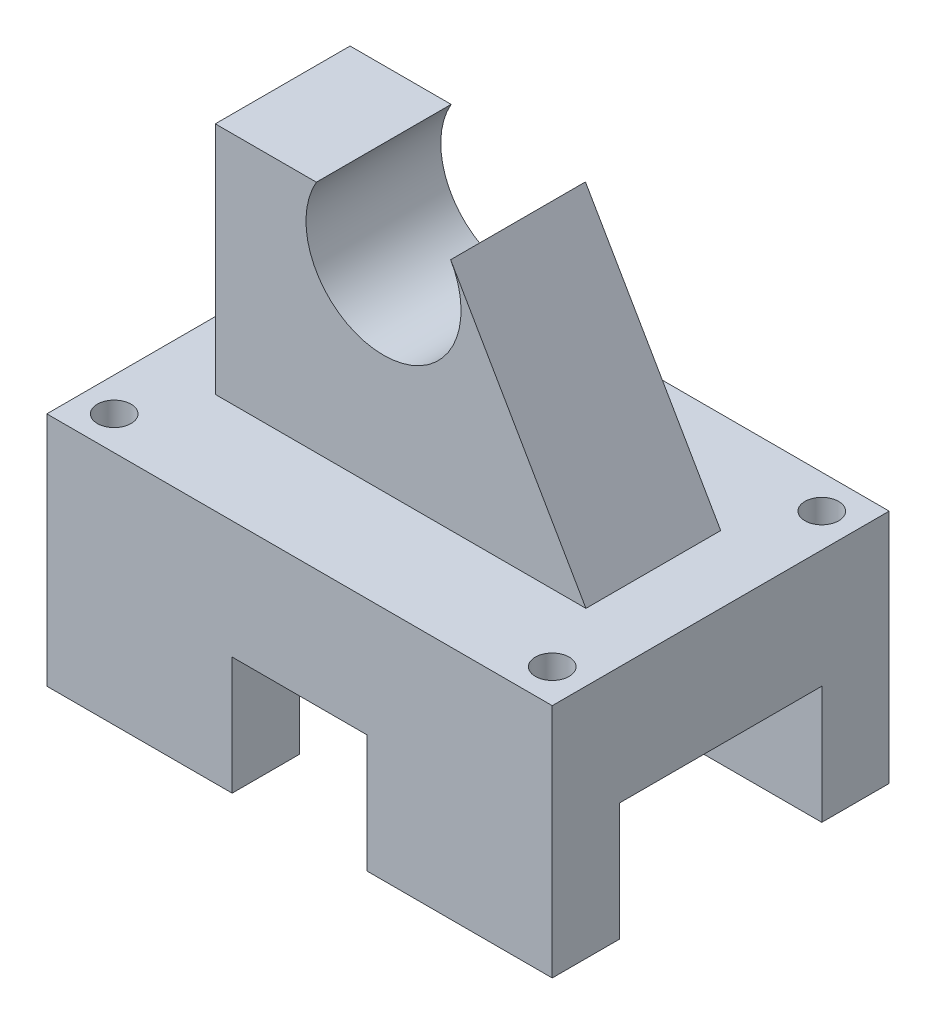
ISO-10303-21;
HEADER;
FILE_DESCRIPTION(('STEP AP214'),'2;1');
FILE_NAME('part.step','',(''),(''),'','','');
FILE_SCHEMA(('AUTOMOTIVE_DESIGN { 1 0 10303 214 1 1 1 1 }'));
ENDSEC;
DATA;
#1=APPLICATION_CONTEXT('core data for automotive mechanical design processes');
#2=APPLICATION_PROTOCOL_DEFINITION('international standard','automotive_design',2000,#1);
#3=PRODUCT_CONTEXT('',#1,'mechanical');
#4=PRODUCT('Part','Part','',(#3));
#5=PRODUCT_RELATED_PRODUCT_CATEGORY('part','',(#4));
#6=PRODUCT_DEFINITION_FORMATION('','',#4);
#7=PRODUCT_DEFINITION_CONTEXT('part definition',#1,'design');
#8=PRODUCT_DEFINITION('design','',#6,#7);
#9=PRODUCT_DEFINITION_SHAPE('','',#8);
#10=(LENGTH_UNIT() NAMED_UNIT(*) SI_UNIT(.MILLI.,.METRE.));
#11=(NAMED_UNIT(*) PLANE_ANGLE_UNIT() SI_UNIT($,.RADIAN.));
#12=(NAMED_UNIT(*) SI_UNIT($,.STERADIAN.) SOLID_ANGLE_UNIT());
#13=UNCERTAINTY_MEASURE_WITH_UNIT(LENGTH_MEASURE(1.E-05),#10,'distance_accuracy_value','');
#14=(GEOMETRIC_REPRESENTATION_CONTEXT(3) GLOBAL_UNCERTAINTY_ASSIGNED_CONTEXT((#13)) GLOBAL_UNIT_ASSIGNED_CONTEXT((#10,
#11,#12)) REPRESENTATION_CONTEXT('',''));
#15=CARTESIAN_POINT('',(0.,0.,0.));
#16=DIRECTION('',(0.,0.,1.));
#17=DIRECTION('',(1.,0.,0.));
#18=AXIS2_PLACEMENT_3D('',#15,#16,#17);
#19=CARTESIAN_POINT('',(-75.,-35.,100.));
#20=DIRECTION('',(0.,1.,0.));
#21=DIRECTION('',(0.,0.,1.));
#22=AXIS2_PLACEMENT_3D('',#19,#20,#21);
#23=PLANE('',#22);
#24=DIRECTION('',(0.,0.,-1.));
#25=VECTOR('',#24,1.);
#26=CARTESIAN_POINT('',(-75.,-35.,100.));
#27=LINE('',#26,#25);
#28=CARTESIAN_POINT('',(-75.,-35.,100.));
#29=VERTEX_POINT('',#28);
#30=CARTESIAN_POINT('',(-75.,-35.,80.));
#31=VERTEX_POINT('',#30);
#32=EDGE_CURVE('E356',#29,#31,#27,.T.);
#33=ORIENTED_EDGE('',*,*,#32,.T.);
#34=DIRECTION('',(1.,0.,0.));
#35=VECTOR('',#34,1.);
#36=CARTESIAN_POINT('',(-75.,-35.,80.));
#37=LINE('',#36,#35);
#38=CARTESIAN_POINT('',(-20.,-35.,80.));
#39=VERTEX_POINT('',#38);
#40=EDGE_CURVE('E265',#31,#39,#37,.T.);
#41=ORIENTED_EDGE('',*,*,#40,.T.);
#42=DIRECTION('',(0.,0.,1.));
#43=VECTOR('',#42,1.);
#44=CARTESIAN_POINT('',(-20.,-35.,0.));
#45=LINE('',#44,#43);
#46=CARTESIAN_POINT('',(-20.,-35.,100.));
#47=VERTEX_POINT('',#46);
#48=EDGE_CURVE('E305',#39,#47,#45,.T.);
#49=ORIENTED_EDGE('',*,*,#48,.T.);
#50=DIRECTION('',(1.,0.,0.));
#51=VECTOR('',#50,1.);
#52=CARTESIAN_POINT('',(-75.,-35.,100.));
#53=LINE('',#52,#51);
#54=EDGE_CURVE('E332',#29,#47,#53,.T.);
#55=ORIENTED_EDGE('',*,*,#54,.F.);
#56=EDGE_LOOP('',(#33,#41,#49,#55));
#57=FACE_BOUND('',#56,.T.);
#58=ADVANCED_FACE('F43',(#57),#23,.F.);
#59=DIRECTION('',(0.,0.,1.));
#60=VECTOR('',#59,1.);
#61=CARTESIAN_POINT('',(20.,-35.,0.));
#62=LINE('',#61,#60);
#63=CARTESIAN_POINT('',(20.,-35.,80.));
#64=VERTEX_POINT('',#63);
#65=CARTESIAN_POINT('',(20.,-35.,100.));
#66=VERTEX_POINT('',#65);
#67=EDGE_CURVE('E289',#64,#66,#62,.T.);
#68=ORIENTED_EDGE('',*,*,#67,.F.);
#69=CARTESIAN_POINT('',(75.,-35.,80.));
#70=VERTEX_POINT('',#69);
#71=EDGE_CURVE('E240',#64,#70,#37,.T.);
#72=ORIENTED_EDGE('',*,*,#71,.T.);
#73=DIRECTION('',(0.,0.,-1.));
#74=VECTOR('',#73,1.);
#75=CARTESIAN_POINT('',(75.,-35.,100.));
#76=LINE('',#75,#74);
#77=CARTESIAN_POINT('',(75.,-35.,100.));
#78=VERTEX_POINT('',#77);
#79=EDGE_CURVE('E351',#78,#70,#76,.T.);
#80=ORIENTED_EDGE('',*,*,#79,.F.);
#81=EDGE_CURVE('E331',#66,#78,#53,.T.);
#82=ORIENTED_EDGE('',*,*,#81,.F.);
#83=EDGE_LOOP('',(#68,#72,#80,#82));
#84=FACE_BOUND('',#83,.T.);
#85=ADVANCED_FACE('F473',(#84),#23,.F.);
#86=CARTESIAN_POINT('',(-20.,-35.,0.));
#87=DIRECTION('',(-1.,0.,0.));
#88=DIRECTION('',(0.,-1.,0.));
#89=AXIS2_PLACEMENT_3D('',#86,#87,#88);
#90=PLANE('',#89);
#91=ORIENTED_EDGE('',*,*,#48,.F.);
#92=DIRECTION('',(0.,1.,0.));
#93=VECTOR('',#92,1.);
#94=CARTESIAN_POINT('',(-20.,-35.,80.));
#95=LINE('',#94,#93);
#96=CARTESIAN_POINT('',(-20.,0.,80.));
#97=VERTEX_POINT('',#96);
#98=EDGE_CURVE('E271',#39,#97,#95,.T.);
#99=ORIENTED_EDGE('',*,*,#98,.T.);
#100=DIRECTION('',(0.,0.,1.));
#101=VECTOR('',#100,1.);
#102=CARTESIAN_POINT('',(-20.,0.,0.));
#103=LINE('',#102,#101);
#104=CARTESIAN_POINT('',(-20.,0.,100.));
#105=VERTEX_POINT('',#104);
#106=EDGE_CURVE('E310',#97,#105,#103,.T.);
#107=ORIENTED_EDGE('',*,*,#106,.T.);
#108=DIRECTION('',(0.,-1.,0.));
#109=VECTOR('',#108,1.);
#110=CARTESIAN_POINT('',(-20.,-35.,100.));
#111=LINE('',#110,#109);
#112=EDGE_CURVE('E281',#105,#47,#111,.T.);
#113=ORIENTED_EDGE('',*,*,#112,.T.);
#114=EDGE_LOOP('',(#91,#99,#107,#113));
#115=FACE_BOUND('',#114,.T.);
#116=ADVANCED_FACE('F479',(#115),#90,.F.);
#117=CARTESIAN_POINT('',(20.,0.,0.));
#118=DIRECTION('',(1.,0.,0.));
#119=DIRECTION('',(0.,1.,0.));
#120=AXIS2_PLACEMENT_3D('',#117,#118,#119);
#121=PLANE('',#120);
#122=DIRECTION('',(0.,0.,1.));
#123=VECTOR('',#122,1.);
#124=CARTESIAN_POINT('',(20.,0.,0.));
#125=LINE('',#124,#123);
#126=CARTESIAN_POINT('',(20.,0.,80.));
#127=VERTEX_POINT('',#126);
#128=CARTESIAN_POINT('',(20.,0.,100.));
#129=VERTEX_POINT('',#128);
#130=EDGE_CURVE('E315',#127,#129,#125,.T.);
#131=ORIENTED_EDGE('',*,*,#130,.F.);
#132=DIRECTION('',(0.,-1.,0.));
#133=VECTOR('',#132,1.);
#134=CARTESIAN_POINT('',(20.,0.,80.));
#135=LINE('',#134,#133);
#136=EDGE_CURVE('E11',#127,#64,#135,.T.);
#137=ORIENTED_EDGE('',*,*,#136,.T.);
#138=ORIENTED_EDGE('',*,*,#67,.T.);
#139=DIRECTION('',(0.,1.,0.));
#140=VECTOR('',#139,1.);
#141=CARTESIAN_POINT('',(20.,0.,100.));
#142=LINE('',#141,#140);
#143=EDGE_CURVE('E275',#66,#129,#142,.T.);
#144=ORIENTED_EDGE('',*,*,#143,.T.);
#145=EDGE_LOOP('',(#131,#137,#138,#144));
#146=FACE_BOUND('',#145,.T.);
#147=ADVANCED_FACE('F494',(#146),#121,.F.);
#148=CARTESIAN_POINT('',(-20.,-35.,0.));
#149=VERTEX_POINT('',#148);
#150=CARTESIAN_POINT('',(-20.,-35.,20.));
#151=VERTEX_POINT('',#150);
#152=EDGE_CURVE('E300',#149,#151,#45,.T.);
#153=ORIENTED_EDGE('',*,*,#152,.T.);
#154=DIRECTION('',(1.,0.,0.));
#155=VECTOR('',#154,1.);
#156=CARTESIAN_POINT('',(-75.,-35.,20.));
#157=LINE('',#156,#155);
#158=CARTESIAN_POINT('',(-75.,-35.,20.));
#159=VERTEX_POINT('',#158);
#160=EDGE_CURVE('E67',#159,#151,#157,.T.);
#161=ORIENTED_EDGE('',*,*,#160,.F.);
#162=CARTESIAN_POINT('',(-75.,-35.,0.));
#163=VERTEX_POINT('',#162);
#164=EDGE_CURVE('E355',#159,#163,#27,.T.);
#165=ORIENTED_EDGE('',*,*,#164,.T.);
#166=DIRECTION('',(1.,0.,0.));
#167=VECTOR('',#166,1.);
#168=CARTESIAN_POINT('',(-75.,-35.,0.));
#169=LINE('',#168,#167);
#170=EDGE_CURVE('E325',#163,#149,#169,.T.);
#171=ORIENTED_EDGE('',*,*,#170,.T.);
#172=EDGE_LOOP('',(#153,#161,#165,#171));
#173=FACE_BOUND('',#172,.T.);
#174=ADVANCED_FACE('F481',(#173),#23,.F.);
#175=CARTESIAN_POINT('',(75.,35.,100.));
#176=DIRECTION('',(-1.,0.,0.));
#177=DIRECTION('',(0.,0.,1.));
#178=AXIS2_PLACEMENT_3D('',#175,#176,#177);
#179=PLANE('',#178);
#180=ORIENTED_EDGE('',*,*,#79,.T.);
#181=DIRECTION('',(0.,-1.,0.));
#182=VECTOR('',#181,1.);
#183=CARTESIAN_POINT('',(75.,0.,80.));
#184=LINE('',#183,#182);
#185=CARTESIAN_POINT('',(75.,0.,80.));
#186=VERTEX_POINT('',#185);
#187=EDGE_CURVE('E241',#186,#70,#184,.T.);
#188=ORIENTED_EDGE('',*,*,#187,.F.);
#189=DIRECTION('',(0.,0.,1.));
#190=VECTOR('',#189,1.);
#191=CARTESIAN_POINT('',(75.,0.,80.));
#192=LINE('',#191,#190);
#193=CARTESIAN_POINT('',(75.,0.,20.));
#194=VERTEX_POINT('',#193);
#195=EDGE_CURVE('E232',#194,#186,#192,.T.);
#196=ORIENTED_EDGE('',*,*,#195,.F.);
#197=DIRECTION('',(0.,1.,0.));
#198=VECTOR('',#197,1.);
#199=CARTESIAN_POINT('',(75.,0.,20.));
#200=LINE('',#199,#198);
#201=CARTESIAN_POINT('',(75.,-35.,20.));
#202=VERTEX_POINT('',#201);
#203=EDGE_CURVE('E244',#202,#194,#200,.T.);
#204=ORIENTED_EDGE('',*,*,#203,.F.);
#205=CARTESIAN_POINT('',(75.,-35.,0.));
#206=VERTEX_POINT('',#205);
#207=EDGE_CURVE('E336',#202,#206,#76,.T.);
#208=ORIENTED_EDGE('',*,*,#207,.T.);
#209=DIRECTION('',(0.,1.,0.));
#210=VECTOR('',#209,1.);
#211=CARTESIAN_POINT('',(75.,35.,0.));
#212=LINE('',#211,#210);
#213=CARTESIAN_POINT('',(75.,35.,0.));
#214=VERTEX_POINT('',#213);
#215=EDGE_CURVE('E304',#206,#214,#212,.T.);
#216=ORIENTED_EDGE('',*,*,#215,.T.);
#217=DIRECTION('',(0.,0.,-1.));
#218=VECTOR('',#217,1.);
#219=CARTESIAN_POINT('',(75.,35.,100.));
#220=LINE('',#219,#218);
#221=CARTESIAN_POINT('',(75.,35.,100.));
#222=VERTEX_POINT('',#221);
#223=EDGE_CURVE('E364',#222,#214,#220,.T.);
#224=ORIENTED_EDGE('',*,*,#223,.F.);
#225=DIRECTION('',(0.,1.,0.));
#226=VECTOR('',#225,1.);
#227=CARTESIAN_POINT('',(75.,35.,100.));
#228=LINE('',#227,#226);
#229=EDGE_CURVE('E320',#78,#222,#228,.T.);
#230=ORIENTED_EDGE('',*,*,#229,.F.);
#231=EDGE_LOOP('',(#180,#188,#196,#204,#208,#216,#224,#230));
#232=FACE_BOUND('',#231,.T.);
#233=ADVANCED_FACE('F45',(#232),#179,.F.);
#234=CARTESIAN_POINT('',(-75.,35.,100.));
#235=DIRECTION('',(0.,-1.,0.));
#236=DIRECTION('',(0.,0.,-1.));
#237=AXIS2_PLACEMENT_3D('',#234,#235,#236);
#238=PLANE('',#237);
#239=CARTESIAN_POINT('',(65.0000000000008,35.,90.));
#240=DIRECTION('',(0.,1.,0.));
#241=DIRECTION('',(0.,0.,1.));
#242=AXIS2_PLACEMENT_3D('',#239,#240,#241);
#243=CIRCLE('',#242,5.);
#244=CARTESIAN_POINT('',(65.0000000000008,35.,95.));
#245=VERTEX_POINT('',#244);
#246=EDGE_CURVE('E430',#245,#245,#243,.T.);
#247=ORIENTED_EDGE('',*,*,#246,.F.);
#248=EDGE_LOOP('',(#247));
#249=FACE_BOUND('',#248,.T.);
#250=CARTESIAN_POINT('',(-64.9999999999992,35.,90.0000000000009));
#251=DIRECTION('',(0.,1.,0.));
#252=DIRECTION('',(0.,0.,1.));
#253=AXIS2_PLACEMENT_3D('',#250,#251,#252);
#254=CIRCLE('',#253,5.00000000000001);
#255=CARTESIAN_POINT('',(-64.9999999999992,35.,95.0000000000009));
#256=VERTEX_POINT('',#255);
#257=EDGE_CURVE('E438',#256,#256,#254,.T.);
#258=ORIENTED_EDGE('',*,*,#257,.F.);
#259=EDGE_LOOP('',(#258));
#260=FACE_BOUND('',#259,.T.);
#261=CARTESIAN_POINT('',(-65.,35.,10.0000000000009));
#262=DIRECTION('',(0.,1.,0.));
#263=DIRECTION('',(0.,0.,1.));
#264=AXIS2_PLACEMENT_3D('',#261,#262,#263);
#265=CIRCLE('',#264,5.);
#266=CARTESIAN_POINT('',(-65.,35.,15.0000000000009));
#267=VERTEX_POINT('',#266);
#268=EDGE_CURVE('E422',#267,#267,#265,.T.);
#269=ORIENTED_EDGE('',*,*,#268,.F.);
#270=EDGE_LOOP('',(#269));
#271=FACE_BOUND('',#270,.T.);
#272=CARTESIAN_POINT('',(65.,35.,10.));
#273=DIRECTION('',(0.,1.,0.));
#274=DIRECTION('',(0.,0.,1.));
#275=AXIS2_PLACEMENT_3D('',#272,#273,#274);
#276=CIRCLE('',#275,5.);
#277=CARTESIAN_POINT('',(65.,35.,15.));
#278=VERTEX_POINT('',#277);
#279=EDGE_CURVE('E418',#278,#278,#276,.T.);
#280=ORIENTED_EDGE('',*,*,#279,.F.);
#281=EDGE_LOOP('',(#280));
#282=FACE_BOUND('',#281,.T.);
#283=DIRECTION('',(1.,0.,0.));
#284=VECTOR('',#283,1.);
#285=CARTESIAN_POINT('',(55.,35.,30.));
#286=LINE('',#285,#284);
#287=CARTESIAN_POINT('',(-55.,35.,30.));
#288=VERTEX_POINT('',#287);
#289=CARTESIAN_POINT('',(55.,35.,30.));
#290=VERTEX_POINT('',#289);
#291=EDGE_CURVE('E214',#288,#290,#286,.T.);
#292=ORIENTED_EDGE('',*,*,#291,.T.);
#293=DIRECTION('',(0.,0.,1.));
#294=VECTOR('',#293,1.);
#295=CARTESIAN_POINT('',(55.,35.,30.));
#296=LINE('',#295,#294);
#297=CARTESIAN_POINT('',(55.,35.,70.));
#298=VERTEX_POINT('',#297);
#299=EDGE_CURVE('E191',#290,#298,#296,.T.);
#300=ORIENTED_EDGE('',*,*,#299,.T.);
#301=DIRECTION('',(1.,0.,0.));
#302=VECTOR('',#301,1.);
#303=CARTESIAN_POINT('',(55.,35.,70.));
#304=LINE('',#303,#302);
#305=CARTESIAN_POINT('',(-55.,35.,70.));
#306=VERTEX_POINT('',#305);
#307=EDGE_CURVE('E199',#306,#298,#304,.T.);
#308=ORIENTED_EDGE('',*,*,#307,.F.);
#309=DIRECTION('',(0.,0.,1.));
#310=VECTOR('',#309,1.);
#311=CARTESIAN_POINT('',(-55.,35.,30.));
#312=LINE('',#311,#310);
#313=EDGE_CURVE('E245',#288,#306,#312,.T.);
#314=ORIENTED_EDGE('',*,*,#313,.F.);
#315=EDGE_LOOP('',(#292,#300,#308,#314));
#316=FACE_BOUND('',#315,.T.);
#317=DIRECTION('',(-1.,0.,0.));
#318=VECTOR('',#317,1.);
#319=CARTESIAN_POINT('',(-75.,35.,0.));
#320=LINE('',#319,#318);
#321=CARTESIAN_POINT('',(-75.,35.,0.));
#322=VERTEX_POINT('',#321);
#323=EDGE_CURVE('E340',#214,#322,#320,.T.);
#324=ORIENTED_EDGE('',*,*,#323,.T.);
#325=DIRECTION('',(0.,0.,-1.));
#326=VECTOR('',#325,1.);
#327=CARTESIAN_POINT('',(-75.,35.,100.));
#328=LINE('',#327,#326);
#329=CARTESIAN_POINT('',(-75.,35.,100.));
#330=VERTEX_POINT('',#329);
#331=EDGE_CURVE('E360',#330,#322,#328,.T.);
#332=ORIENTED_EDGE('',*,*,#331,.F.);
#333=DIRECTION('',(-1.,0.,0.));
#334=VECTOR('',#333,1.);
#335=CARTESIAN_POINT('',(-75.,35.,100.));
#336=LINE('',#335,#334);
#337=EDGE_CURVE('E324',#222,#330,#336,.T.);
#338=ORIENTED_EDGE('',*,*,#337,.F.);
#339=ORIENTED_EDGE('',*,*,#223,.T.);
#340=EDGE_LOOP('',(#324,#332,#338,#339));
#341=FACE_BOUND('',#340,.T.);
#342=ADVANCED_FACE('F212',(#249,#260,#271,#282,#316,#341),#238,.F.);
#343=CARTESIAN_POINT('',(-75.,35.,100.));
#344=DIRECTION('',(1.,0.,0.));
#345=DIRECTION('',(0.,1.,0.));
#346=AXIS2_PLACEMENT_3D('',#343,#344,#345);
#347=PLANE('',#346);
#348=DIRECTION('',(0.,0.,1.));
#349=VECTOR('',#348,1.);
#350=CARTESIAN_POINT('',(-75.,0.,80.));
#351=LINE('',#350,#349);
#352=CARTESIAN_POINT('',(-75.,0.,20.));
#353=VERTEX_POINT('',#352);
#354=CARTESIAN_POINT('',(-75.,0.,80.));
#355=VERTEX_POINT('',#354);
#356=EDGE_CURVE('E236',#353,#355,#351,.T.);
#357=ORIENTED_EDGE('',*,*,#356,.T.);
#358=DIRECTION('',(0.,-1.,0.));
#359=VECTOR('',#358,1.);
#360=CARTESIAN_POINT('',(-75.,0.,80.));
#361=LINE('',#360,#359);
#362=EDGE_CURVE('E227',#355,#31,#361,.T.);
#363=ORIENTED_EDGE('',*,*,#362,.T.);
#364=ORIENTED_EDGE('',*,*,#32,.F.);
#365=DIRECTION('',(0.,-1.,0.));
#366=VECTOR('',#365,1.);
#367=CARTESIAN_POINT('',(-75.,35.,100.));
#368=LINE('',#367,#366);
#369=EDGE_CURVE('E328',#330,#29,#368,.T.);
#370=ORIENTED_EDGE('',*,*,#369,.F.);
#371=ORIENTED_EDGE('',*,*,#331,.T.);
#372=DIRECTION('',(0.,-1.,0.));
#373=VECTOR('',#372,1.);
#374=CARTESIAN_POINT('',(-75.,35.,0.));
#375=LINE('',#374,#373);
#376=EDGE_CURVE('E343',#322,#163,#375,.T.);
#377=ORIENTED_EDGE('',*,*,#376,.T.);
#378=ORIENTED_EDGE('',*,*,#164,.F.);
#379=DIRECTION('',(0.,1.,0.));
#380=VECTOR('',#379,1.);
#381=CARTESIAN_POINT('',(-75.,0.,20.));
#382=LINE('',#381,#380);
#383=EDGE_CURVE('E231',#159,#353,#382,.T.);
#384=ORIENTED_EDGE('',*,*,#383,.T.);
#385=EDGE_LOOP('',(#357,#363,#364,#370,#371,#377,#378,#384));
#386=FACE_BOUND('',#385,.T.);
#387=ADVANCED_FACE('F454',(#386),#347,.F.);
#388=ORIENTED_EDGE('',*,*,#207,.F.);
#389=CARTESIAN_POINT('',(20.,-35.,20.));
#390=VERTEX_POINT('',#389);
#391=EDGE_CURVE('E264',#390,#202,#157,.T.);
#392=ORIENTED_EDGE('',*,*,#391,.F.);
#393=CARTESIAN_POINT('',(20.,-35.,0.));
#394=VERTEX_POINT('',#393);
#395=EDGE_CURVE('E316',#394,#390,#62,.T.);
#396=ORIENTED_EDGE('',*,*,#395,.F.);
#397=EDGE_CURVE('E347',#394,#206,#169,.T.);
#398=ORIENTED_EDGE('',*,*,#397,.T.);
#399=EDGE_LOOP('',(#388,#392,#396,#398));
#400=FACE_BOUND('',#399,.T.);
#401=ADVANCED_FACE('F386',(#400),#23,.F.);
#402=CARTESIAN_POINT('',(0.,0.,100.));
#403=DIRECTION('',(0.,0.,1.));
#404=DIRECTION('',(1.,0.,0.));
#405=AXIS2_PLACEMENT_3D('',#402,#403,#404);
#406=PLANE('',#405);
#407=ORIENTED_EDGE('',*,*,#112,.F.);
#408=DIRECTION('',(-1.,0.,0.));
#409=VECTOR('',#408,1.);
#410=CARTESIAN_POINT('',(-20.,0.,100.));
#411=LINE('',#410,#409);
#412=EDGE_CURVE('E293',#129,#105,#411,.T.);
#413=ORIENTED_EDGE('',*,*,#412,.F.);
#414=ORIENTED_EDGE('',*,*,#143,.F.);
#415=ORIENTED_EDGE('',*,*,#81,.T.);
#416=ORIENTED_EDGE('',*,*,#229,.T.);
#417=ORIENTED_EDGE('',*,*,#337,.T.);
#418=ORIENTED_EDGE('',*,*,#369,.T.);
#419=ORIENTED_EDGE('',*,*,#54,.T.);
#420=EDGE_LOOP('',(#407,#413,#414,#415,#416,#417,#418,#419));
#421=FACE_BOUND('',#420,.T.);
#422=ADVANCED_FACE('F485',(#421),#406,.T.);
#423=CARTESIAN_POINT('',(0.,0.,0.));
#424=DIRECTION('',(0.,0.,1.));
#425=DIRECTION('',(1.,0.,0.));
#426=AXIS2_PLACEMENT_3D('',#423,#424,#425);
#427=PLANE('',#426);
#428=DIRECTION('',(-1.,0.,0.));
#429=VECTOR('',#428,1.);
#430=CARTESIAN_POINT('',(-20.,0.,0.));
#431=LINE('',#430,#429);
#432=CARTESIAN_POINT('',(20.,0.,0.));
#433=VERTEX_POINT('',#432);
#434=CARTESIAN_POINT('',(-20.,0.,0.));
#435=VERTEX_POINT('',#434);
#436=EDGE_CURVE('E280',#433,#435,#431,.T.);
#437=ORIENTED_EDGE('',*,*,#436,.T.);
#438=DIRECTION('',(0.,-1.,0.));
#439=VECTOR('',#438,1.);
#440=CARTESIAN_POINT('',(-20.,-35.,0.));
#441=LINE('',#440,#439);
#442=EDGE_CURVE('E285',#435,#149,#441,.T.);
#443=ORIENTED_EDGE('',*,*,#442,.T.);
#444=ORIENTED_EDGE('',*,*,#170,.F.);
#445=ORIENTED_EDGE('',*,*,#376,.F.);
#446=ORIENTED_EDGE('',*,*,#323,.F.);
#447=ORIENTED_EDGE('',*,*,#215,.F.);
#448=ORIENTED_EDGE('',*,*,#397,.F.);
#449=DIRECTION('',(0.,1.,0.));
#450=VECTOR('',#449,1.);
#451=CARTESIAN_POINT('',(20.,0.,0.));
#452=LINE('',#451,#450);
#453=EDGE_CURVE('E276',#394,#433,#452,.T.);
#454=ORIENTED_EDGE('',*,*,#453,.T.);
#455=EDGE_LOOP('',(#437,#443,#444,#445,#446,#447,#448,#454));
#456=FACE_BOUND('',#455,.T.);
#457=ADVANCED_FACE('F379',(#456),#427,.F.);
#458=CARTESIAN_POINT('',(-20.,0.,20.));
#459=VERTEX_POINT('',#458);
#460=EDGE_CURVE('E306',#435,#459,#103,.T.);
#461=ORIENTED_EDGE('',*,*,#460,.T.);
#462=DIRECTION('',(0.,-1.,0.));
#463=VECTOR('',#462,1.);
#464=CARTESIAN_POINT('',(-20.,-35.,20.));
#465=LINE('',#464,#463);
#466=EDGE_CURVE('E255',#459,#151,#465,.T.);
#467=ORIENTED_EDGE('',*,*,#466,.T.);
#468=ORIENTED_EDGE('',*,*,#152,.F.);
#469=ORIENTED_EDGE('',*,*,#442,.F.);
#470=EDGE_LOOP('',(#461,#467,#468,#469));
#471=FACE_BOUND('',#470,.T.);
#472=ADVANCED_FACE('F505',(#471),#90,.F.);
#473=CARTESIAN_POINT('',(-20.,0.,0.));
#474=DIRECTION('',(0.,1.,0.));
#475=DIRECTION('',(0.,0.,1.));
#476=AXIS2_PLACEMENT_3D('',#473,#474,#475);
#477=PLANE('',#476);
#478=CARTESIAN_POINT('',(20.,0.,20.));
#479=VERTEX_POINT('',#478);
#480=EDGE_CURVE('E311',#433,#479,#125,.T.);
#481=ORIENTED_EDGE('',*,*,#480,.T.);
#482=DIRECTION('',(1.,0.,0.));
#483=VECTOR('',#482,1.);
#484=CARTESIAN_POINT('',(-75.,0.,20.));
#485=LINE('',#484,#483);
#486=EDGE_CURVE('E261',#479,#194,#485,.T.);
#487=ORIENTED_EDGE('',*,*,#486,.T.);
#488=ORIENTED_EDGE('',*,*,#195,.T.);
#489=DIRECTION('',(1.,0.,0.));
#490=VECTOR('',#489,1.);
#491=CARTESIAN_POINT('',(-75.,0.,80.));
#492=LINE('',#491,#490);
#493=EDGE_CURVE('E256',#127,#186,#492,.T.);
#494=ORIENTED_EDGE('',*,*,#493,.F.);
#495=ORIENTED_EDGE('',*,*,#130,.T.);
#496=ORIENTED_EDGE('',*,*,#412,.T.);
#497=ORIENTED_EDGE('',*,*,#106,.F.);
#498=EDGE_CURVE('E252',#355,#97,#492,.T.);
#499=ORIENTED_EDGE('',*,*,#498,.F.);
#500=ORIENTED_EDGE('',*,*,#356,.F.);
#501=EDGE_CURVE('E257',#353,#459,#485,.T.);
#502=ORIENTED_EDGE('',*,*,#501,.T.);
#503=ORIENTED_EDGE('',*,*,#460,.F.);
#504=ORIENTED_EDGE('',*,*,#436,.F.);
#505=EDGE_LOOP('',(#481,#487,#488,#494,#495,#496,#497,#499,#500,#502,#503,#504));
#506=FACE_BOUND('',#505,.T.);
#507=ADVANCED_FACE('F376',(#506),#477,.F.);
#508=ORIENTED_EDGE('',*,*,#395,.T.);
#509=DIRECTION('',(0.,1.,0.));
#510=VECTOR('',#509,1.);
#511=CARTESIAN_POINT('',(20.,0.,20.));
#512=LINE('',#511,#510);
#513=EDGE_CURVE('E52',#390,#479,#512,.T.);
#514=ORIENTED_EDGE('',*,*,#513,.T.);
#515=ORIENTED_EDGE('',*,*,#480,.F.);
#516=ORIENTED_EDGE('',*,*,#453,.F.);
#517=EDGE_LOOP('',(#508,#514,#515,#516));
#518=FACE_BOUND('',#517,.T.);
#519=ADVANCED_FACE('F371',(#518),#121,.F.);
#520=CARTESIAN_POINT('',(-75.,0.,20.));
#521=DIRECTION('',(0.,0.,-1.));
#522=DIRECTION('',(0.,1.,0.));
#523=AXIS2_PLACEMENT_3D('',#520,#521,#522);
#524=PLANE('',#523);
#525=ORIENTED_EDGE('',*,*,#391,.T.);
#526=ORIENTED_EDGE('',*,*,#203,.T.);
#527=ORIENTED_EDGE('',*,*,#486,.F.);
#528=ORIENTED_EDGE('',*,*,#513,.F.);
#529=EDGE_LOOP('',(#525,#526,#527,#528));
#530=FACE_BOUND('',#529,.T.);
#531=ADVANCED_FACE('F542',(#530),#524,.F.);
#532=CARTESIAN_POINT('',(-75.,0.,80.));
#533=DIRECTION('',(0.,0.,1.));
#534=DIRECTION('',(0.,-1.,0.));
#535=AXIS2_PLACEMENT_3D('',#532,#533,#534);
#536=PLANE('',#535);
#537=ORIENTED_EDGE('',*,*,#493,.T.);
#538=ORIENTED_EDGE('',*,*,#187,.T.);
#539=ORIENTED_EDGE('',*,*,#71,.F.);
#540=ORIENTED_EDGE('',*,*,#136,.F.);
#541=EDGE_LOOP('',(#537,#538,#539,#540));
#542=FACE_BOUND('',#541,.T.);
#543=ADVANCED_FACE('F522',(#542),#536,.F.);
#544=ORIENTED_EDGE('',*,*,#40,.F.);
#545=ORIENTED_EDGE('',*,*,#362,.F.);
#546=ORIENTED_EDGE('',*,*,#498,.T.);
#547=ORIENTED_EDGE('',*,*,#98,.F.);
#548=EDGE_LOOP('',(#544,#545,#546,#547));
#549=FACE_BOUND('',#548,.T.);
#550=ADVANCED_FACE('F538',(#549),#536,.F.);
#551=ORIENTED_EDGE('',*,*,#501,.F.);
#552=ORIENTED_EDGE('',*,*,#383,.F.);
#553=ORIENTED_EDGE('',*,*,#160,.T.);
#554=ORIENTED_EDGE('',*,*,#466,.F.);
#555=EDGE_LOOP('',(#551,#552,#553,#554));
#556=FACE_BOUND('',#555,.T.);
#557=ADVANCED_FACE('F506',(#556),#524,.F.);
#558=CARTESIAN_POINT('',(-55.,35.,30.));
#559=DIRECTION('',(-1.,0.,0.));
#560=DIRECTION('',(0.,-1.,0.));
#561=AXIS2_PLACEMENT_3D('',#558,#559,#560);
#562=PLANE('',#561);
#563=ORIENTED_EDGE('',*,*,#313,.T.);
#564=DIRECTION('',(0.,-1.,0.));
#565=VECTOR('',#564,1.);
#566=CARTESIAN_POINT('',(-55.,35.,70.));
#567=LINE('',#566,#565);
#568=CARTESIAN_POINT('',(-55.,104.541644452903,70.));
#569=VERTEX_POINT('',#568);
#570=EDGE_CURVE('E206',#569,#306,#567,.T.);
#571=ORIENTED_EDGE('',*,*,#570,.F.);
#572=DIRECTION('',(0.,0.,1.));
#573=VECTOR('',#572,1.);
#574=CARTESIAN_POINT('',(-55.,104.541644452903,30.));
#575=LINE('',#574,#573);
#576=CARTESIAN_POINT('',(-55.,104.541644452903,30.));
#577=VERTEX_POINT('',#576);
#578=EDGE_CURVE('E394',#577,#569,#575,.T.);
#579=ORIENTED_EDGE('',*,*,#578,.F.);
#580=DIRECTION('',(0.,-1.,0.));
#581=VECTOR('',#580,1.);
#582=CARTESIAN_POINT('',(-55.,35.,30.));
#583=LINE('',#582,#581);
#584=EDGE_CURVE('E216',#577,#288,#583,.T.);
#585=ORIENTED_EDGE('',*,*,#584,.T.);
#586=EDGE_LOOP('',(#563,#571,#579,#585));
#587=FACE_BOUND('',#586,.T.);
#588=ADVANCED_FACE('F552',(#587),#562,.T.);
#589=CARTESIAN_POINT('',(-55.,104.541644452903,30.));
#590=DIRECTION('',(0.,1.,0.));
#591=DIRECTION('',(0.,0.,1.));
#592=AXIS2_PLACEMENT_3D('',#589,#590,#591);
#593=PLANE('',#592);
#594=ORIENTED_EDGE('',*,*,#578,.T.);
#595=DIRECTION('',(-1.,0.,0.));
#596=VECTOR('',#595,1.);
#597=CARTESIAN_POINT('',(-55.,104.541644452903,70.));
#598=LINE('',#597,#596);
#599=CARTESIAN_POINT('',(-25.,104.541644452903,70.));
#600=VERTEX_POINT('',#599);
#601=EDGE_CURVE('E413',#600,#569,#598,.T.);
#602=ORIENTED_EDGE('',*,*,#601,.F.);
#603=DIRECTION('',(0.,0.,1.));
#604=VECTOR('',#603,1.);
#605=CARTESIAN_POINT('',(-25.,104.541644452903,30.));
#606=LINE('',#605,#604);
#607=CARTESIAN_POINT('',(-25.,104.541644452903,30.));
#608=VERTEX_POINT('',#607);
#609=EDGE_CURVE('E220',#608,#600,#606,.T.);
#610=ORIENTED_EDGE('',*,*,#609,.F.);
#611=DIRECTION('',(-1.,0.,0.));
#612=VECTOR('',#611,1.);
#613=CARTESIAN_POINT('',(-55.,104.541644452903,30.));
#614=LINE('',#613,#612);
#615=EDGE_CURVE('E223',#608,#577,#614,.T.);
#616=ORIENTED_EDGE('',*,*,#615,.T.);
#617=EDGE_LOOP('',(#594,#602,#610,#616));
#618=FACE_BOUND('',#617,.T.);
#619=ADVANCED_FACE('F557',(#618),#593,.T.);
#620=CARTESIAN_POINT('',(-5.07494357238632,93.0379077608018,30.));
#621=DIRECTION('',(0.,0.,1.));
#622=DIRECTION('',(1.,0.,0.));
#623=AXIS2_PLACEMENT_3D('',#620,#621,#622);
#624=CYLINDRICAL_SURFACE('',#623,23.0074733842026);
#625=ORIENTED_EDGE('',*,*,#609,.T.);
#626=CARTESIAN_POINT('',(-5.07494357238632,93.0379077608018,70.));
#627=DIRECTION('',(0.,0.,-1.));
#628=DIRECTION('',(-1.,0.,0.));
#629=AXIS2_PLACEMENT_3D('',#626,#627,#628);
#630=CIRCLE('',#629,23.0074733842026);
#631=CARTESIAN_POINT('',(14.8501128552273,104.541644452903,70.));
#632=VERTEX_POINT('',#631);
#633=EDGE_CURVE('E198',#632,#600,#630,.T.);
#634=ORIENTED_EDGE('',*,*,#633,.F.);
#635=DIRECTION('',(0.,0.,1.));
#636=VECTOR('',#635,1.);
#637=CARTESIAN_POINT('',(14.8501128552273,104.541644452903,30.));
#638=LINE('',#637,#636);
#639=CARTESIAN_POINT('',(14.8501128552273,104.541644452903,30.));
#640=VERTEX_POINT('',#639);
#641=EDGE_CURVE('E193',#640,#632,#638,.T.);
#642=ORIENTED_EDGE('',*,*,#641,.F.);
#643=CARTESIAN_POINT('',(-5.07494357238632,93.0379077608018,30.));
#644=DIRECTION('',(0.,0.,-1.));
#645=DIRECTION('',(-1.,0.,0.));
#646=AXIS2_PLACEMENT_3D('',#643,#644,#645);
#647=CIRCLE('',#646,23.0074733842026);
#648=EDGE_CURVE('E404',#640,#608,#647,.T.);
#649=ORIENTED_EDGE('',*,*,#648,.T.);
#650=EDGE_LOOP('',(#625,#634,#642,#649));
#651=FACE_BOUND('',#650,.T.);
#652=ADVANCED_FACE('F624',(#651),#624,.F.);
#653=CARTESIAN_POINT('',(55.,35.,30.));
#654=DIRECTION('',(0.86602540378444,0.499999999999998,0.));
#655=DIRECTION('',(-0.499999999999998,0.86602540378444,0.));
#656=AXIS2_PLACEMENT_3D('',#653,#654,#655);
#657=PLANE('',#656);
#658=ORIENTED_EDGE('',*,*,#641,.T.);
#659=DIRECTION('',(-0.499999999999998,0.86602540378444,0.));
#660=VECTOR('',#659,1.);
#661=CARTESIAN_POINT('',(55.,35.,70.));
#662=LINE('',#661,#660);
#663=EDGE_CURVE('E187',#298,#632,#662,.T.);
#664=ORIENTED_EDGE('',*,*,#663,.F.);
#665=ORIENTED_EDGE('',*,*,#299,.F.);
#666=DIRECTION('',(-0.499999999999998,0.86602540378444,0.));
#667=VECTOR('',#666,1.);
#668=CARTESIAN_POINT('',(55.,35.,30.));
#669=LINE('',#668,#667);
#670=EDGE_CURVE('E59',#290,#640,#669,.T.);
#671=ORIENTED_EDGE('',*,*,#670,.T.);
#672=EDGE_LOOP('',(#658,#664,#665,#671));
#673=FACE_BOUND('',#672,.T.);
#674=ADVANCED_FACE('F189',(#673),#657,.T.);
#675=CARTESIAN_POINT('',(-5.07494357238632,93.0379077608018,30.));
#676=DIRECTION('',(0.,0.,-1.));
#677=DIRECTION('',(-1.,0.,0.));
#678=AXIS2_PLACEMENT_3D('',#675,#676,#677);
#679=PLANE('',#678);
#680=ORIENTED_EDGE('',*,*,#291,.F.);
#681=ORIENTED_EDGE('',*,*,#584,.F.);
#682=ORIENTED_EDGE('',*,*,#615,.F.);
#683=ORIENTED_EDGE('',*,*,#648,.F.);
#684=ORIENTED_EDGE('',*,*,#670,.F.);
#685=EDGE_LOOP('',(#680,#681,#682,#683,#684));
#686=FACE_BOUND('',#685,.T.);
#687=ADVANCED_FACE('F469',(#686),#679,.T.);
#688=CARTESIAN_POINT('',(-5.07494357238632,93.0379077608018,70.));
#689=DIRECTION('',(0.,0.,-1.));
#690=DIRECTION('',(-1.,0.,0.));
#691=AXIS2_PLACEMENT_3D('',#688,#689,#690);
#692=PLANE('',#691);
#693=ORIENTED_EDGE('',*,*,#307,.T.);
#694=ORIENTED_EDGE('',*,*,#663,.T.);
#695=ORIENTED_EDGE('',*,*,#633,.T.);
#696=ORIENTED_EDGE('',*,*,#601,.T.);
#697=ORIENTED_EDGE('',*,*,#570,.T.);
#698=EDGE_LOOP('',(#693,#694,#695,#696,#697));
#699=FACE_BOUND('',#698,.T.);
#700=ADVANCED_FACE('F203',(#699),#692,.F.);
#701=CARTESIAN_POINT('',(65.,-15.,10.));
#702=DIRECTION('',(0.,1.,0.));
#703=DIRECTION('',(0.,0.,1.));
#704=AXIS2_PLACEMENT_3D('',#701,#702,#703);
#705=CYLINDRICAL_SURFACE('',#704,5.);
#706=CARTESIAN_POINT('',(65.,-15.,10.));
#707=DIRECTION('',(0.,1.,0.));
#708=DIRECTION('',(0.,0.,1.));
#709=AXIS2_PLACEMENT_3D('',#706,#707,#708);
#710=CIRCLE('',#709,5.);
#711=CARTESIAN_POINT('',(65.,-15.,15.));
#712=VERTEX_POINT('',#711);
#713=EDGE_CURVE('E210',#712,#712,#710,.T.);
#714=ORIENTED_EDGE('',*,*,#713,.F.);
#715=EDGE_LOOP('',(#714));
#716=FACE_BOUND('',#715,.T.);
#717=ORIENTED_EDGE('',*,*,#279,.T.);
#718=EDGE_LOOP('',(#717));
#719=FACE_BOUND('',#718,.T.);
#720=ADVANCED_FACE('F458',(#716,#719),#705,.F.);
#721=CARTESIAN_POINT('',(65.,-15.,10.));
#722=DIRECTION('',(0.,1.,0.));
#723=DIRECTION('',(0.,0.,1.));
#724=AXIS2_PLACEMENT_3D('',#721,#722,#723);
#725=PLANE('',#724);
#726=ORIENTED_EDGE('',*,*,#713,.T.);
#727=EDGE_LOOP('',(#726));
#728=FACE_BOUND('',#727,.T.);
#729=ADVANCED_FACE('F460',(#728),#725,.T.);
#730=CARTESIAN_POINT('',(-65.,-15.,10.0000000000009));
#731=DIRECTION('',(0.,1.,0.));
#732=DIRECTION('',(0.,0.,1.));
#733=AXIS2_PLACEMENT_3D('',#730,#731,#732);
#734=CYLINDRICAL_SURFACE('',#733,5.);
#735=CARTESIAN_POINT('',(-65.,-15.,10.0000000000009));
#736=DIRECTION('',(0.,1.,0.));
#737=DIRECTION('',(0.,0.,1.));
#738=AXIS2_PLACEMENT_3D('',#735,#736,#737);
#739=CIRCLE('',#738,5.);
#740=CARTESIAN_POINT('',(-65.,-15.,15.0000000000009));
#741=VERTEX_POINT('',#740);
#742=EDGE_CURVE('E442',#741,#741,#739,.T.);
#743=ORIENTED_EDGE('',*,*,#742,.F.);
#744=EDGE_LOOP('',(#743));
#745=FACE_BOUND('',#744,.T.);
#746=ORIENTED_EDGE('',*,*,#268,.T.);
#747=EDGE_LOOP('',(#746));
#748=FACE_BOUND('',#747,.T.);
#749=ADVANCED_FACE('F450',(#745,#748),#734,.F.);
#750=CARTESIAN_POINT('',(-65.,-15.,10.0000000000009));
#751=DIRECTION('',(0.,1.,0.));
#752=DIRECTION('',(0.,0.,1.));
#753=AXIS2_PLACEMENT_3D('',#750,#751,#752);
#754=PLANE('',#753);
#755=ORIENTED_EDGE('',*,*,#742,.T.);
#756=EDGE_LOOP('',(#755));
#757=FACE_BOUND('',#756,.T.);
#758=ADVANCED_FACE('F689',(#757),#754,.T.);
#759=CARTESIAN_POINT('',(-64.9999999999992,-15.,90.0000000000009));
#760=DIRECTION('',(0.,1.,0.));
#761=DIRECTION('',(0.,0.,1.));
#762=AXIS2_PLACEMENT_3D('',#759,#760,#761);
#763=CYLINDRICAL_SURFACE('',#762,5.00000000000001);
#764=CARTESIAN_POINT('',(-64.9999999999992,-15.,90.0000000000009));
#765=DIRECTION('',(0.,1.,0.));
#766=DIRECTION('',(0.,0.,1.));
#767=AXIS2_PLACEMENT_3D('',#764,#765,#766);
#768=CIRCLE('',#767,5.00000000000001);
#769=CARTESIAN_POINT('',(-64.9999999999992,-15.,95.0000000000009));
#770=VERTEX_POINT('',#769);
#771=EDGE_CURVE('E434',#770,#770,#768,.T.);
#772=ORIENTED_EDGE('',*,*,#771,.F.);
#773=EDGE_LOOP('',(#772));
#774=FACE_BOUND('',#773,.T.);
#775=ORIENTED_EDGE('',*,*,#257,.T.);
#776=EDGE_LOOP('',(#775));
#777=FACE_BOUND('',#776,.T.);
#778=ADVANCED_FACE('F700',(#774,#777),#763,.F.);
#779=CARTESIAN_POINT('',(-64.9999999999992,-15.,90.0000000000009));
#780=DIRECTION('',(0.,1.,0.));
#781=DIRECTION('',(0.,0.,1.));
#782=AXIS2_PLACEMENT_3D('',#779,#780,#781);
#783=PLANE('',#782);
#784=ORIENTED_EDGE('',*,*,#771,.T.);
#785=EDGE_LOOP('',(#784));
#786=FACE_BOUND('',#785,.T.);
#787=ADVANCED_FACE('F711',(#786),#783,.T.);
#788=CARTESIAN_POINT('',(65.0000000000008,-15.,90.));
#789=DIRECTION('',(0.,1.,0.));
#790=DIRECTION('',(0.,0.,1.));
#791=AXIS2_PLACEMENT_3D('',#788,#789,#790);
#792=CYLINDRICAL_SURFACE('',#791,5.);
#793=CARTESIAN_POINT('',(65.0000000000008,-15.,90.));
#794=DIRECTION('',(0.,1.,0.));
#795=DIRECTION('',(0.,0.,1.));
#796=AXIS2_PLACEMENT_3D('',#793,#794,#795);
#797=CIRCLE('',#796,5.);
#798=CARTESIAN_POINT('',(65.0000000000008,-15.,95.));
#799=VERTEX_POINT('',#798);
#800=EDGE_CURVE('E426',#799,#799,#797,.T.);
#801=ORIENTED_EDGE('',*,*,#800,.F.);
#802=EDGE_LOOP('',(#801));
#803=FACE_BOUND('',#802,.T.);
#804=ORIENTED_EDGE('',*,*,#246,.T.);
#805=EDGE_LOOP('',(#804));
#806=FACE_BOUND('',#805,.T.);
#807=ADVANCED_FACE('F722',(#803,#806),#792,.F.);
#808=CARTESIAN_POINT('',(65.0000000000008,-15.,90.));
#809=DIRECTION('',(0.,1.,0.));
#810=DIRECTION('',(0.,0.,1.));
#811=AXIS2_PLACEMENT_3D('',#808,#809,#810);
#812=PLANE('',#811);
#813=ORIENTED_EDGE('',*,*,#800,.T.);
#814=EDGE_LOOP('',(#813));
#815=FACE_BOUND('',#814,.T.);
#816=ADVANCED_FACE('F733',(#815),#812,.T.);
#817=CLOSED_SHELL('',(#58,#85,#116,#147,#174,#233,#342,#387,#401,#422,#457,#472,#507,#519,#531,
#543,#550,#557,#588,#619,#652,#674,#687,#700,#720,#729,#749,#758,#778,#787,#807,#816));
#818=MANIFOLD_SOLID_BREP('B2',#817);
#819=ADVANCED_BREP_SHAPE_REPRESENTATION('',(#18,#818),#14);
#820=SHAPE_DEFINITION_REPRESENTATION(#9,#819);
ENDSEC;
END-ISO-10303-21;
